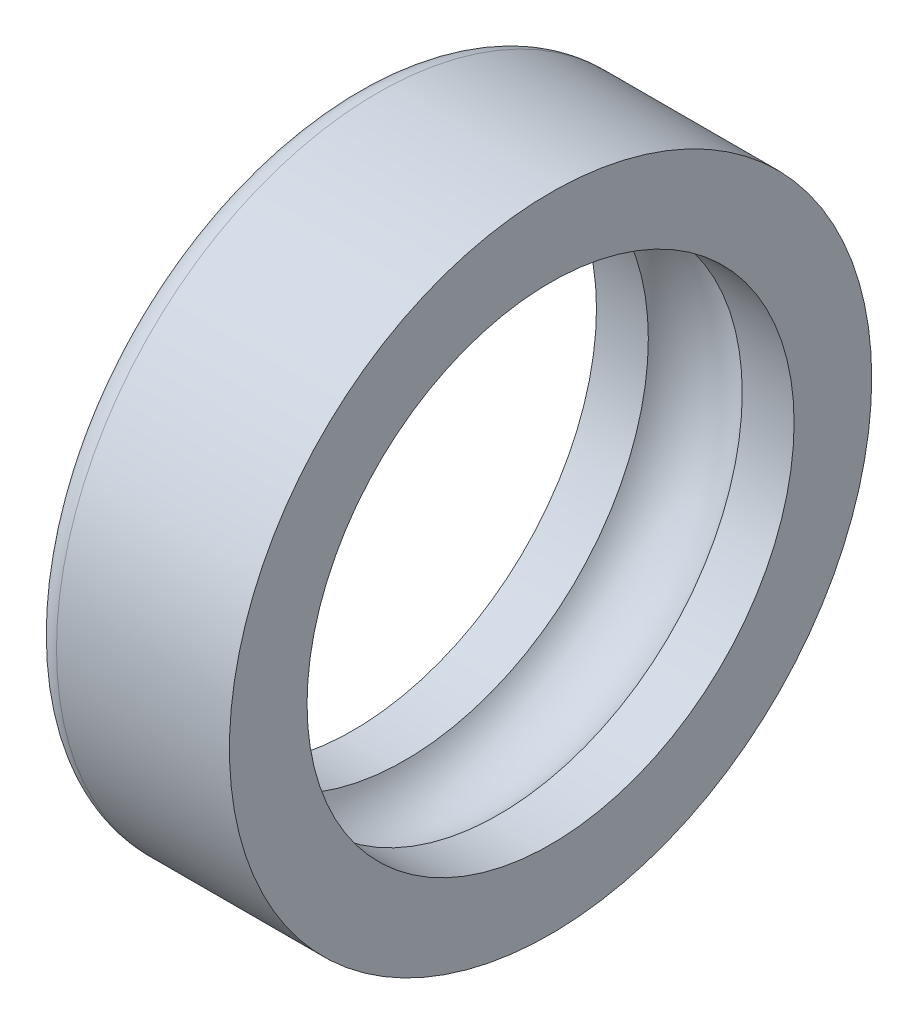
ISO-10303-21;
HEADER;
FILE_DESCRIPTION(('STEP AP214'),'2;1');
FILE_NAME('part.step','',(''),(''),'','','');
FILE_SCHEMA(('AUTOMOTIVE_DESIGN { 1 0 10303 214 1 1 1 1 }'));
ENDSEC;
DATA;
#1=APPLICATION_CONTEXT('core data for automotive mechanical design processes');
#2=APPLICATION_PROTOCOL_DEFINITION('international standard','automotive_design',2000,#1);
#3=PRODUCT_CONTEXT('',#1,'mechanical');
#4=PRODUCT('Part','Part','',(#3));
#5=PRODUCT_RELATED_PRODUCT_CATEGORY('part','',(#4));
#6=PRODUCT_DEFINITION_FORMATION('','',#4);
#7=PRODUCT_DEFINITION_CONTEXT('part definition',#1,'design');
#8=PRODUCT_DEFINITION('design','',#6,#7);
#9=PRODUCT_DEFINITION_SHAPE('','',#8);
#10=(LENGTH_UNIT() NAMED_UNIT(*) SI_UNIT(.MILLI.,.METRE.));
#11=(NAMED_UNIT(*) PLANE_ANGLE_UNIT() SI_UNIT($,.RADIAN.));
#12=(NAMED_UNIT(*) SI_UNIT($,.STERADIAN.) SOLID_ANGLE_UNIT());
#13=UNCERTAINTY_MEASURE_WITH_UNIT(LENGTH_MEASURE(1.E-05),#10,'distance_accuracy_value','');
#14=(GEOMETRIC_REPRESENTATION_CONTEXT(3) GLOBAL_UNCERTAINTY_ASSIGNED_CONTEXT((#13)) GLOBAL_UNIT_ASSIGNED_CONTEXT((#10,
#11,#12)) REPRESENTATION_CONTEXT('',''));
#15=CARTESIAN_POINT('',(0.,0.,0.));
#16=DIRECTION('',(0.,0.,1.));
#17=DIRECTION('',(1.,0.,0.));
#18=AXIS2_PLACEMENT_3D('',#15,#16,#17);
#19=CARTESIAN_POINT('',(-4.,4.25,0.));
#20=DIRECTION('',(-1.,0.,0.));
#21=DIRECTION('',(0.,0.,1.));
#22=AXIS2_PLACEMENT_3D('',#19,#20,#21);
#23=PLANE('',#22);
#24=CARTESIAN_POINT('',(-4.,-8.75,0.));
#25=DIRECTION('',(-1.,0.,0.));
#26=DIRECTION('',(0.,0.,1.));
#27=AXIS2_PLACEMENT_3D('',#24,#25,#26);
#28=CIRCLE('',#27,12.);
#29=CARTESIAN_POINT('',(-4.,-8.75,12.));
#30=VERTEX_POINT('',#29);
#31=EDGE_CURVE('E10',#30,#30,#28,.T.);
#32=ORIENTED_EDGE('',*,*,#31,.T.);
#33=EDGE_LOOP('',(#32));
#34=FACE_BOUND('',#33,.T.);
#35=CARTESIAN_POINT('',(-4.,-8.75,0.));
#36=DIRECTION('',(1.,0.,0.));
#37=DIRECTION('',(0.,0.,-1.));
#38=AXIS2_PLACEMENT_3D('',#35,#36,#37);
#39=CIRCLE('',#38,9.858);
#40=CARTESIAN_POINT('',(-4.,-8.75,-9.858));
#41=VERTEX_POINT('',#40);
#42=EDGE_CURVE('E45',#41,#41,#39,.T.);
#43=ORIENTED_EDGE('',*,*,#42,.T.);
#44=EDGE_LOOP('',(#43));
#45=FACE_BOUND('',#44,.T.);
#46=ADVANCED_FACE('F34',(#34,#45),#23,.T.);
#47=CARTESIAN_POINT('',(4.,-8.75,0.));
#48=DIRECTION('',(1.,0.,0.));
#49=DIRECTION('',(0.,0.,-1.));
#50=AXIS2_PLACEMENT_3D('',#47,#48,#49);
#51=CYLINDRICAL_SURFACE('',#50,9.858);
#52=CARTESIAN_POINT('',(-1.90061463742654,-8.75,0.));
#53=DIRECTION('',(1.,0.,0.));
#54=DIRECTION('',(0.,0.,-1.));
#55=AXIS2_PLACEMENT_3D('',#52,#53,#54);
#56=CIRCLE('',#55,9.858);
#57=CARTESIAN_POINT('',(-1.90061463742654,-8.75,-9.858));
#58=VERTEX_POINT('',#57);
#59=EDGE_CURVE('E49',#58,#58,#56,.T.);
#60=ORIENTED_EDGE('',*,*,#59,.T.);
#61=EDGE_LOOP('',(#60));
#62=FACE_BOUND('',#61,.T.);
#63=ORIENTED_EDGE('',*,*,#42,.F.);
#64=EDGE_LOOP('',(#63));
#65=FACE_BOUND('',#64,.T.);
#66=ADVANCED_FACE('F78',(#62,#65),#51,.F.);
#67=CARTESIAN_POINT('',(0.,-8.75,0.));
#68=DIRECTION('',(1.,0.,0.));
#69=DIRECTION('',(0.,0.,-1.));
#70=AXIS2_PLACEMENT_3D('',#67,#68,#69);
#71=TOROIDAL_SURFACE('',#70,8.75,2.2);
#72=CARTESIAN_POINT('',(1.90061463742653,-8.75,0.));
#73=DIRECTION('',(1.,0.,0.));
#74=DIRECTION('',(0.,0.,-1.));
#75=AXIS2_PLACEMENT_3D('',#72,#73,#74);
#76=CIRCLE('',#75,9.858);
#77=CARTESIAN_POINT('',(1.90061463742653,-8.75,-9.858));
#78=VERTEX_POINT('',#77);
#79=EDGE_CURVE('E54',#78,#78,#76,.T.);
#80=ORIENTED_EDGE('',*,*,#79,.T.);
#81=EDGE_LOOP('',(#80));
#82=FACE_BOUND('',#81,.T.);
#83=ORIENTED_EDGE('',*,*,#59,.F.);
#84=EDGE_LOOP('',(#83));
#85=FACE_BOUND('',#84,.T.);
#86=ADVANCED_FACE('F82',(#82,#85),#71,.F.);
#87=CARTESIAN_POINT('',(4.,-8.75,0.));
#88=DIRECTION('',(1.,0.,0.));
#89=DIRECTION('',(0.,0.,-1.));
#90=AXIS2_PLACEMENT_3D('',#87,#88,#89);
#91=CYLINDRICAL_SURFACE('',#90,9.858);
#92=CARTESIAN_POINT('',(4.,-8.75,0.));
#93=DIRECTION('',(1.,0.,0.));
#94=DIRECTION('',(0.,0.,-1.));
#95=AXIS2_PLACEMENT_3D('',#92,#93,#94);
#96=CIRCLE('',#95,9.858);
#97=CARTESIAN_POINT('',(4.,-8.75,-9.858));
#98=VERTEX_POINT('',#97);
#99=EDGE_CURVE('E57',#98,#98,#96,.T.);
#100=ORIENTED_EDGE('',*,*,#99,.T.);
#101=EDGE_LOOP('',(#100));
#102=FACE_BOUND('',#101,.T.);
#103=ORIENTED_EDGE('',*,*,#79,.F.);
#104=EDGE_LOOP('',(#103));
#105=FACE_BOUND('',#104,.T.);
#106=ADVANCED_FACE('F75',(#102,#105),#91,.F.);
#107=CARTESIAN_POINT('',(4.,4.25,0.));
#108=DIRECTION('',(1.,0.,0.));
#109=DIRECTION('',(0.,0.,-1.));
#110=AXIS2_PLACEMENT_3D('',#107,#108,#109);
#111=PLANE('',#110);
#112=CARTESIAN_POINT('',(4.,-8.75,0.));
#113=DIRECTION('',(1.,0.,0.));
#114=DIRECTION('',(0.,0.,-1.));
#115=AXIS2_PLACEMENT_3D('',#112,#113,#114);
#116=CIRCLE('',#115,13.);
#117=CARTESIAN_POINT('',(4.,-8.75,-13.));
#118=VERTEX_POINT('',#117);
#119=EDGE_CURVE('E60',#118,#118,#116,.T.);
#120=ORIENTED_EDGE('',*,*,#119,.T.);
#121=EDGE_LOOP('',(#120));
#122=FACE_BOUND('',#121,.T.);
#123=ORIENTED_EDGE('',*,*,#99,.F.);
#124=EDGE_LOOP('',(#123));
#125=FACE_BOUND('',#124,.T.);
#126=ADVANCED_FACE('F64',(#122,#125),#111,.T.);
#127=CARTESIAN_POINT('',(4.,-8.75,0.));
#128=DIRECTION('',(1.,0.,0.));
#129=DIRECTION('',(0.,0.,-1.));
#130=AXIS2_PLACEMENT_3D('',#127,#128,#129);
#131=CYLINDRICAL_SURFACE('',#130,13.);
#132=CARTESIAN_POINT('',(-3.,-8.75,0.));
#133=DIRECTION('',(-1.,0.,0.));
#134=DIRECTION('',(0.,0.,1.));
#135=AXIS2_PLACEMENT_3D('',#132,#133,#134);
#136=CIRCLE('',#135,13.);
#137=CARTESIAN_POINT('',(-3.,-8.75,13.));
#138=VERTEX_POINT('',#137);
#139=EDGE_CURVE('E41',#138,#138,#136,.F.);
#140=ORIENTED_EDGE('',*,*,#139,.T.);
#141=EDGE_LOOP('',(#140));
#142=FACE_BOUND('',#141,.T.);
#143=ORIENTED_EDGE('',*,*,#119,.F.);
#144=EDGE_LOOP('',(#143));
#145=FACE_BOUND('',#144,.T.);
#146=ADVANCED_FACE('F67',(#142,#145),#131,.T.);
#147=CARTESIAN_POINT('',(-3.,-8.75,0.));
#148=DIRECTION('',(-1.,0.,0.));
#149=DIRECTION('',(0.,0.,1.));
#150=AXIS2_PLACEMENT_3D('',#147,#148,#149);
#151=TOROIDAL_SURFACE('',#150,12.,1.);
#152=ORIENTED_EDGE('',*,*,#31,.F.);
#153=EDGE_LOOP('',(#152));
#154=FACE_BOUND('',#153,.T.);
#155=ORIENTED_EDGE('',*,*,#139,.F.);
#156=EDGE_LOOP('',(#155));
#157=FACE_BOUND('',#156,.T.);
#158=ADVANCED_FACE('F36',(#154,#157),#151,.T.);
#159=CLOSED_SHELL('',(#46,#66,#86,#106,#126,#146,#158));
#160=MANIFOLD_SOLID_BREP('B2',#159);
#161=ADVANCED_BREP_SHAPE_REPRESENTATION('',(#18,#160),#14);
#162=SHAPE_DEFINITION_REPRESENTATION(#9,#161);
ENDSEC;
END-ISO-10303-21;
